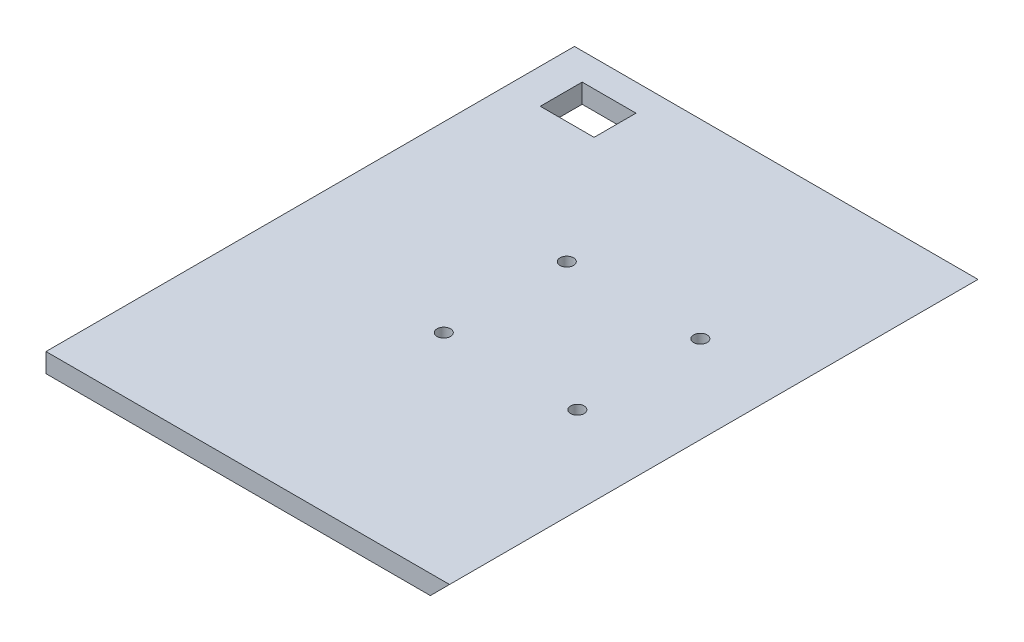
ISO-10303-21;
HEADER;
FILE_DESCRIPTION(('STEP AP214'),'2;1');
FILE_NAME('part.step','',(''),(''),'','','');
FILE_SCHEMA(('AUTOMOTIVE_DESIGN { 1 0 10303 214 1 1 1 1 }'));
ENDSEC;
DATA;
#1=APPLICATION_CONTEXT('core data for automotive mechanical design processes');
#2=APPLICATION_PROTOCOL_DEFINITION('international standard','automotive_design',2000,#1);
#3=PRODUCT_CONTEXT('',#1,'mechanical');
#4=PRODUCT('Part','Part','',(#3));
#5=PRODUCT_RELATED_PRODUCT_CATEGORY('part','',(#4));
#6=PRODUCT_DEFINITION_FORMATION('','',#4);
#7=PRODUCT_DEFINITION_CONTEXT('part definition',#1,'design');
#8=PRODUCT_DEFINITION('design','',#6,#7);
#9=PRODUCT_DEFINITION_SHAPE('','',#8);
#10=(LENGTH_UNIT() NAMED_UNIT(*) SI_UNIT(.MILLI.,.METRE.));
#11=(NAMED_UNIT(*) PLANE_ANGLE_UNIT() SI_UNIT($,.RADIAN.));
#12=(NAMED_UNIT(*) SI_UNIT($,.STERADIAN.) SOLID_ANGLE_UNIT());
#13=UNCERTAINTY_MEASURE_WITH_UNIT(LENGTH_MEASURE(1.E-05),#10,'distance_accuracy_value','');
#14=(GEOMETRIC_REPRESENTATION_CONTEXT(3) GLOBAL_UNCERTAINTY_ASSIGNED_CONTEXT((#13)) GLOBAL_UNIT_ASSIGNED_CONTEXT((#10,
#11,#12)) REPRESENTATION_CONTEXT('',''));
#15=CARTESIAN_POINT('',(0.,0.,0.));
#16=DIRECTION('',(0.,0.,1.));
#17=DIRECTION('',(1.,0.,0.));
#18=AXIS2_PLACEMENT_3D('',#15,#16,#17);
#19=CARTESIAN_POINT('',(200.,10.,0.));
#20=DIRECTION('',(0.,0.,-1.));
#21=DIRECTION('',(-1.,0.,0.));
#22=AXIS2_PLACEMENT_3D('',#19,#20,#21);
#23=PLANE('',#22);
#24=DIRECTION('',(-1.,0.,0.));
#25=VECTOR('',#24,1.);
#26=CARTESIAN_POINT('',(200.,0.,0.));
#27=LINE('',#26,#25);
#28=CARTESIAN_POINT('',(200.,0.,0.));
#29=VERTEX_POINT('',#28);
#30=CARTESIAN_POINT('',(0.,0.,0.));
#31=VERTEX_POINT('',#30);
#32=EDGE_CURVE('E11',#29,#31,#27,.T.);
#33=ORIENTED_EDGE('',*,*,#32,.F.);
#34=DIRECTION('',(0.707106781186557,0.707106781186538,0.));
#35=VECTOR('',#34,1.);
#36=CARTESIAN_POINT('',(210.,10.,0.));
#37=LINE('',#36,#35);
#38=CARTESIAN_POINT('',(210.,10.,0.));
#39=VERTEX_POINT('',#38);
#40=EDGE_CURVE('E165',#29,#39,#37,.T.);
#41=ORIENTED_EDGE('',*,*,#40,.T.);
#42=DIRECTION('',(-1.,0.,0.));
#43=VECTOR('',#42,1.);
#44=CARTESIAN_POINT('',(200.,10.,0.));
#45=LINE('',#44,#43);
#46=CARTESIAN_POINT('',(0.,10.,0.));
#47=VERTEX_POINT('',#46);
#48=EDGE_CURVE('E183',#39,#47,#45,.T.);
#49=ORIENTED_EDGE('',*,*,#48,.T.);
#50=DIRECTION('',(0.,-1.,0.));
#51=VECTOR('',#50,1.);
#52=CARTESIAN_POINT('',(0.,10.,0.));
#53=LINE('',#52,#51);
#54=EDGE_CURVE('E173',#47,#31,#53,.T.);
#55=ORIENTED_EDGE('',*,*,#54,.T.);
#56=EDGE_LOOP('',(#33,#41,#49,#55));
#57=FACE_BOUND('',#56,.T.);
#58=ADVANCED_FACE('F41',(#57),#23,.F.);
#59=CARTESIAN_POINT('',(200.,0.,0.));
#60=DIRECTION('',(0.,1.,0.));
#61=DIRECTION('',(0.,0.,1.));
#62=AXIS2_PLACEMENT_3D('',#59,#60,#61);
#63=PLANE('',#62);
#64=DIRECTION('',(-1.,0.,0.));
#65=VECTOR('',#64,1.);
#66=CARTESIAN_POINT('',(18.0906878364255,0.,-260.929608881838));
#67=LINE('',#66,#65);
#68=CARTESIAN_POINT('',(46.0906878364255,0.,-260.929608881838));
#69=VERTEX_POINT('',#68);
#70=CARTESIAN_POINT('',(18.0906878364255,0.,-260.929608881838));
#71=VERTEX_POINT('',#70);
#72=EDGE_CURVE('E112',#69,#71,#67,.T.);
#73=ORIENTED_EDGE('',*,*,#72,.T.);
#74=DIRECTION('',(0.,0.,1.));
#75=VECTOR('',#74,1.);
#76=CARTESIAN_POINT('',(18.0906878364255,0.,-260.929608881838));
#77=LINE('',#76,#75);
#78=CARTESIAN_POINT('',(18.0906878364255,0.,-239.129608881838));
#79=VERTEX_POINT('',#78);
#80=EDGE_CURVE('E106',#71,#79,#77,.T.);
#81=ORIENTED_EDGE('',*,*,#80,.T.);
#82=DIRECTION('',(1.,0.,0.));
#83=VECTOR('',#82,1.);
#84=CARTESIAN_POINT('',(18.0906878364255,0.,-239.129608881838));
#85=LINE('',#84,#83);
#86=CARTESIAN_POINT('',(46.0906878364255,0.,-239.129608881838));
#87=VERTEX_POINT('',#86);
#88=EDGE_CURVE('E115',#79,#87,#85,.T.);
#89=ORIENTED_EDGE('',*,*,#88,.T.);
#90=DIRECTION('',(0.,0.,-1.));
#91=VECTOR('',#90,1.);
#92=CARTESIAN_POINT('',(46.0906878364255,0.,-260.929608881838));
#93=LINE('',#92,#91);
#94=EDGE_CURVE('E55',#87,#69,#93,.T.);
#95=ORIENTED_EDGE('',*,*,#94,.T.);
#96=EDGE_LOOP('',(#73,#81,#89,#95));
#97=FACE_BOUND('',#96,.T.);
#98=CARTESIAN_POINT('',(164.499999999957,0.,-176.01));
#99=DIRECTION('',(0.,1.,0.));
#100=DIRECTION('',(0.,0.,1.));
#101=AXIS2_PLACEMENT_3D('',#98,#99,#100);
#102=CIRCLE('',#101,3.50000000000006);
#103=CARTESIAN_POINT('',(164.499999999957,0.,-172.51));
#104=VERTEX_POINT('',#103);
#105=EDGE_CURVE('E147',#104,#104,#102,.F.);
#106=ORIENTED_EDGE('',*,*,#105,.F.);
#107=EDGE_LOOP('',(#106));
#108=FACE_BOUND('',#107,.T.);
#109=CARTESIAN_POINT('',(94.9999999999638,0.,-112.009999999992));
#110=DIRECTION('',(0.,1.,0.));
#111=DIRECTION('',(0.,0.,1.));
#112=AXIS2_PLACEMENT_3D('',#109,#110,#111);
#113=CIRCLE('',#112,3.50000000000002);
#114=CARTESIAN_POINT('',(94.9999999999638,0.,-108.509999999992));
#115=VERTEX_POINT('',#114);
#116=EDGE_CURVE('E146',#115,#115,#113,.F.);
#117=ORIENTED_EDGE('',*,*,#116,.F.);
#118=EDGE_LOOP('',(#117));
#119=FACE_BOUND('',#118,.T.);
#120=CARTESIAN_POINT('',(164.499999999964,0.,-112.01));
#121=DIRECTION('',(0.,1.,0.));
#122=DIRECTION('',(0.,0.,1.));
#123=AXIS2_PLACEMENT_3D('',#120,#121,#122);
#124=CIRCLE('',#123,3.50000000000002);
#125=CARTESIAN_POINT('',(164.499999999964,0.,-108.51));
#126=VERTEX_POINT('',#125);
#127=EDGE_CURVE('E137',#126,#126,#124,.F.);
#128=ORIENTED_EDGE('',*,*,#127,.F.);
#129=EDGE_LOOP('',(#128));
#130=FACE_BOUND('',#129,.T.);
#131=CARTESIAN_POINT('',(94.999999999957,0.,-176.009999999992));
#132=DIRECTION('',(0.,1.,0.));
#133=DIRECTION('',(0.,0.,1.));
#134=AXIS2_PLACEMENT_3D('',#131,#132,#133);
#135=CIRCLE('',#134,3.50000000000005);
#136=CARTESIAN_POINT('',(94.999999999957,0.,-172.509999999992));
#137=VERTEX_POINT('',#136);
#138=EDGE_CURVE('E161',#137,#137,#135,.F.);
#139=ORIENTED_EDGE('',*,*,#138,.F.);
#140=EDGE_LOOP('',(#139));
#141=FACE_BOUND('',#140,.T.);
#142=DIRECTION('',(-1.,0.,0.));
#143=VECTOR('',#142,1.);
#144=CARTESIAN_POINT('',(200.,0.,-275.));
#145=LINE('',#144,#143);
#146=CARTESIAN_POINT('',(200.,0.,-275.));
#147=VERTEX_POINT('',#146);
#148=CARTESIAN_POINT('',(0.,0.,-275.));
#149=VERTEX_POINT('',#148);
#150=EDGE_CURVE('E48',#147,#149,#145,.T.);
#151=ORIENTED_EDGE('',*,*,#150,.F.);
#152=DIRECTION('',(0.,0.,-1.));
#153=VECTOR('',#152,1.);
#154=CARTESIAN_POINT('',(200.,0.,0.));
#155=LINE('',#154,#153);
#156=EDGE_CURVE('E168',#29,#147,#155,.T.);
#157=ORIENTED_EDGE('',*,*,#156,.F.);
#158=ORIENTED_EDGE('',*,*,#32,.T.);
#159=DIRECTION('',(0.,0.,-1.));
#160=VECTOR('',#159,1.);
#161=CARTESIAN_POINT('',(0.,0.,0.));
#162=LINE('',#161,#160);
#163=EDGE_CURVE('E176',#31,#149,#162,.T.);
#164=ORIENTED_EDGE('',*,*,#163,.T.);
#165=EDGE_LOOP('',(#151,#157,#158,#164));
#166=FACE_BOUND('',#165,.T.);
#167=ADVANCED_FACE('F119',(#97,#108,#119,#130,#141,#166),#63,.F.);
#168=CARTESIAN_POINT('',(200.,10.,-275.));
#169=DIRECTION('',(0.,0.,1.));
#170=DIRECTION('',(1.,0.,0.));
#171=AXIS2_PLACEMENT_3D('',#168,#169,#170);
#172=PLANE('',#171);
#173=DIRECTION('',(-1.,0.,0.));
#174=VECTOR('',#173,1.);
#175=CARTESIAN_POINT('',(200.,10.,-275.));
#176=LINE('',#175,#174);
#177=CARTESIAN_POINT('',(210.,10.,-275.));
#178=VERTEX_POINT('',#177);
#179=CARTESIAN_POINT('',(0.,10.,-275.));
#180=VERTEX_POINT('',#179);
#181=EDGE_CURVE('E186',#178,#180,#176,.T.);
#182=ORIENTED_EDGE('',*,*,#181,.F.);
#183=DIRECTION('',(0.707106781186557,0.707106781186538,0.));
#184=VECTOR('',#183,1.);
#185=CARTESIAN_POINT('',(210.,10.,-275.));
#186=LINE('',#185,#184);
#187=EDGE_CURVE('E164',#147,#178,#186,.T.);
#188=ORIENTED_EDGE('',*,*,#187,.F.);
#189=ORIENTED_EDGE('',*,*,#150,.T.);
#190=DIRECTION('',(0.,1.,0.));
#191=VECTOR('',#190,1.);
#192=CARTESIAN_POINT('',(0.,10.,-275.));
#193=LINE('',#192,#191);
#194=EDGE_CURVE('E179',#149,#180,#193,.T.);
#195=ORIENTED_EDGE('',*,*,#194,.T.);
#196=EDGE_LOOP('',(#182,#188,#189,#195));
#197=FACE_BOUND('',#196,.T.);
#198=ADVANCED_FACE('F192',(#197),#172,.F.);
#199=CARTESIAN_POINT('',(200.,10.,0.));
#200=DIRECTION('',(0.,-1.,0.));
#201=DIRECTION('',(0.,0.,-1.));
#202=AXIS2_PLACEMENT_3D('',#199,#200,#201);
#203=PLANE('',#202);
#204=DIRECTION('',(1.,0.,0.));
#205=VECTOR('',#204,1.);
#206=CARTESIAN_POINT('',(18.0906878364255,10.,-239.129608881838));
#207=LINE('',#206,#205);
#208=CARTESIAN_POINT('',(18.0906878364255,10.,-239.129608881838));
#209=VERTEX_POINT('',#208);
#210=CARTESIAN_POINT('',(46.0906878364255,10.,-239.129608881838));
#211=VERTEX_POINT('',#210);
#212=EDGE_CURVE('E131',#209,#211,#207,.T.);
#213=ORIENTED_EDGE('',*,*,#212,.F.);
#214=DIRECTION('',(0.,0.,1.));
#215=VECTOR('',#214,1.);
#216=CARTESIAN_POINT('',(18.0906878364255,10.,-260.929608881838));
#217=LINE('',#216,#215);
#218=CARTESIAN_POINT('',(18.0906878364255,10.,-260.929608881838));
#219=VERTEX_POINT('',#218);
#220=EDGE_CURVE('E63',#219,#209,#217,.T.);
#221=ORIENTED_EDGE('',*,*,#220,.F.);
#222=DIRECTION('',(-1.,0.,0.));
#223=VECTOR('',#222,1.);
#224=CARTESIAN_POINT('',(18.0906878364255,10.,-260.929608881838));
#225=LINE('',#224,#223);
#226=CARTESIAN_POINT('',(46.0906878364255,10.,-260.929608881838));
#227=VERTEX_POINT('',#226);
#228=EDGE_CURVE('E122',#227,#219,#225,.T.);
#229=ORIENTED_EDGE('',*,*,#228,.F.);
#230=DIRECTION('',(0.,0.,-1.));
#231=VECTOR('',#230,1.);
#232=CARTESIAN_POINT('',(46.0906878364255,10.,-260.929608881838));
#233=LINE('',#232,#231);
#234=EDGE_CURVE('E125',#211,#227,#233,.T.);
#235=ORIENTED_EDGE('',*,*,#234,.F.);
#236=EDGE_LOOP('',(#213,#221,#229,#235));
#237=FACE_BOUND('',#236,.T.);
#238=CARTESIAN_POINT('',(164.499999999957,10.,-176.01));
#239=DIRECTION('',(0.,1.,0.));
#240=DIRECTION('',(0.,0.,1.));
#241=AXIS2_PLACEMENT_3D('',#238,#239,#240);
#242=CIRCLE('',#241,3.50000000000006);
#243=CARTESIAN_POINT('',(164.499999999957,10.,-172.51));
#244=VERTEX_POINT('',#243);
#245=EDGE_CURVE('E150',#244,#244,#242,.T.);
#246=ORIENTED_EDGE('',*,*,#245,.F.);
#247=EDGE_LOOP('',(#246));
#248=FACE_BOUND('',#247,.T.);
#249=CARTESIAN_POINT('',(94.9999999999638,10.,-112.009999999992));
#250=DIRECTION('',(0.,1.,0.));
#251=DIRECTION('',(0.,0.,1.));
#252=AXIS2_PLACEMENT_3D('',#249,#250,#251);
#253=CIRCLE('',#252,3.50000000000002);
#254=CARTESIAN_POINT('',(94.9999999999638,10.,-108.509999999992));
#255=VERTEX_POINT('',#254);
#256=EDGE_CURVE('E151',#255,#255,#253,.T.);
#257=ORIENTED_EDGE('',*,*,#256,.F.);
#258=EDGE_LOOP('',(#257));
#259=FACE_BOUND('',#258,.T.);
#260=CARTESIAN_POINT('',(164.499999999964,10.,-112.01));
#261=DIRECTION('',(0.,1.,0.));
#262=DIRECTION('',(0.,0.,1.));
#263=AXIS2_PLACEMENT_3D('',#260,#261,#262);
#264=CIRCLE('',#263,3.50000000000002);
#265=CARTESIAN_POINT('',(164.499999999964,10.,-108.51));
#266=VERTEX_POINT('',#265);
#267=EDGE_CURVE('E143',#266,#266,#264,.T.);
#268=ORIENTED_EDGE('',*,*,#267,.F.);
#269=EDGE_LOOP('',(#268));
#270=FACE_BOUND('',#269,.T.);
#271=CARTESIAN_POINT('',(94.999999999957,10.,-176.009999999992));
#272=DIRECTION('',(0.,1.,0.));
#273=DIRECTION('',(0.,0.,1.));
#274=AXIS2_PLACEMENT_3D('',#271,#272,#273);
#275=CIRCLE('',#274,3.50000000000005);
#276=CARTESIAN_POINT('',(94.999999999957,10.,-172.509999999992));
#277=VERTEX_POINT('',#276);
#278=EDGE_CURVE('E154',#277,#277,#275,.T.);
#279=ORIENTED_EDGE('',*,*,#278,.F.);
#280=EDGE_LOOP('',(#279));
#281=FACE_BOUND('',#280,.T.);
#282=DIRECTION('',(0.,0.,1.));
#283=VECTOR('',#282,1.);
#284=CARTESIAN_POINT('',(0.,10.,0.));
#285=LINE('',#284,#283);
#286=EDGE_CURVE('E181',#180,#47,#285,.T.);
#287=ORIENTED_EDGE('',*,*,#286,.T.);
#288=ORIENTED_EDGE('',*,*,#48,.F.);
#289=DIRECTION('',(0.,0.,1.));
#290=VECTOR('',#289,1.);
#291=CARTESIAN_POINT('',(210.,10.,-275.));
#292=LINE('',#291,#290);
#293=EDGE_CURVE('E171',#178,#39,#292,.T.);
#294=ORIENTED_EDGE('',*,*,#293,.F.);
#295=ORIENTED_EDGE('',*,*,#181,.T.);
#296=EDGE_LOOP('',(#287,#288,#294,#295));
#297=FACE_BOUND('',#296,.T.);
#298=ADVANCED_FACE('F204',(#237,#248,#259,#270,#281,#297),#203,.F.);
#299=CARTESIAN_POINT('',(0.,0.,0.));
#300=DIRECTION('',(1.,0.,0.));
#301=DIRECTION('',(0.,0.,-1.));
#302=AXIS2_PLACEMENT_3D('',#299,#300,#301);
#303=PLANE('',#302);
#304=ORIENTED_EDGE('',*,*,#54,.F.);
#305=ORIENTED_EDGE('',*,*,#286,.F.);
#306=ORIENTED_EDGE('',*,*,#194,.F.);
#307=ORIENTED_EDGE('',*,*,#163,.F.);
#308=EDGE_LOOP('',(#304,#305,#306,#307));
#309=FACE_BOUND('',#308,.T.);
#310=ADVANCED_FACE('F201',(#309),#303,.F.);
#311=CARTESIAN_POINT('',(210.,10.,0.));
#312=DIRECTION('',(-0.707106781186538,0.707106781186557,0.));
#313=DIRECTION('',(-0.707106781186557,-0.707106781186538,0.));
#314=AXIS2_PLACEMENT_3D('',#311,#312,#313);
#315=PLANE('',#314);
#316=ORIENTED_EDGE('',*,*,#187,.T.);
#317=ORIENTED_EDGE('',*,*,#293,.T.);
#318=ORIENTED_EDGE('',*,*,#40,.F.);
#319=ORIENTED_EDGE('',*,*,#156,.T.);
#320=EDGE_LOOP('',(#316,#317,#318,#319));
#321=FACE_BOUND('',#320,.T.);
#322=ADVANCED_FACE('F208',(#321),#315,.F.);
#323=CARTESIAN_POINT('',(94.999999999957,-0.000999999999999265,-176.009999999992));
#324=DIRECTION('',(0.,1.,0.));
#325=DIRECTION('',(0.,0.,1.));
#326=AXIS2_PLACEMENT_3D('',#323,#324,#325);
#327=CYLINDRICAL_SURFACE('',#326,3.50000000000005);
#328=ORIENTED_EDGE('',*,*,#278,.T.);
#329=EDGE_LOOP('',(#328));
#330=FACE_BOUND('',#329,.T.);
#331=ORIENTED_EDGE('',*,*,#138,.T.);
#332=EDGE_LOOP('',(#331));
#333=FACE_BOUND('',#332,.T.);
#334=ADVANCED_FACE('F210',(#330,#333),#327,.F.);
#335=CARTESIAN_POINT('',(164.499999999964,-0.000999999999999265,-112.01));
#336=DIRECTION('',(0.,1.,0.));
#337=DIRECTION('',(0.,0.,1.));
#338=AXIS2_PLACEMENT_3D('',#335,#336,#337);
#339=CYLINDRICAL_SURFACE('',#338,3.50000000000002);
#340=ORIENTED_EDGE('',*,*,#267,.T.);
#341=EDGE_LOOP('',(#340));
#342=FACE_BOUND('',#341,.T.);
#343=ORIENTED_EDGE('',*,*,#127,.T.);
#344=EDGE_LOOP('',(#343));
#345=FACE_BOUND('',#344,.T.);
#346=ADVANCED_FACE('F216',(#342,#345),#339,.F.);
#347=CARTESIAN_POINT('',(94.9999999999638,-0.000999999999999265,-112.009999999992));
#348=DIRECTION('',(0.,1.,0.));
#349=DIRECTION('',(0.,0.,1.));
#350=AXIS2_PLACEMENT_3D('',#347,#348,#349);
#351=CYLINDRICAL_SURFACE('',#350,3.50000000000002);
#352=ORIENTED_EDGE('',*,*,#256,.T.);
#353=EDGE_LOOP('',(#352));
#354=FACE_BOUND('',#353,.T.);
#355=ORIENTED_EDGE('',*,*,#116,.T.);
#356=EDGE_LOOP('',(#355));
#357=FACE_BOUND('',#356,.T.);
#358=ADVANCED_FACE('F250',(#354,#357),#351,.F.);
#359=CARTESIAN_POINT('',(164.499999999957,-0.000999999999999265,-176.01));
#360=DIRECTION('',(0.,1.,0.));
#361=DIRECTION('',(0.,0.,1.));
#362=AXIS2_PLACEMENT_3D('',#359,#360,#361);
#363=CYLINDRICAL_SURFACE('',#362,3.50000000000006);
#364=ORIENTED_EDGE('',*,*,#245,.T.);
#365=EDGE_LOOP('',(#364));
#366=FACE_BOUND('',#365,.T.);
#367=ORIENTED_EDGE('',*,*,#105,.T.);
#368=EDGE_LOOP('',(#367));
#369=FACE_BOUND('',#368,.T.);
#370=ADVANCED_FACE('F257',(#366,#369),#363,.F.);
#371=CARTESIAN_POINT('',(18.0906878364255,0.,-260.929608881838));
#372=DIRECTION('',(-1.,0.,0.));
#373=DIRECTION('',(0.,0.,1.));
#374=AXIS2_PLACEMENT_3D('',#371,#372,#373);
#375=PLANE('',#374);
#376=ORIENTED_EDGE('',*,*,#220,.T.);
#377=DIRECTION('',(0.,1.,0.));
#378=VECTOR('',#377,1.);
#379=CARTESIAN_POINT('',(18.0906878364255,0.,-239.129608881838));
#380=LINE('',#379,#378);
#381=EDGE_CURVE('E102',#79,#209,#380,.T.);
#382=ORIENTED_EDGE('',*,*,#381,.F.);
#383=ORIENTED_EDGE('',*,*,#80,.F.);
#384=DIRECTION('',(0.,1.,0.));
#385=VECTOR('',#384,1.);
#386=CARTESIAN_POINT('',(18.0906878364255,0.,-260.929608881838));
#387=LINE('',#386,#385);
#388=EDGE_CURVE('E135',#71,#219,#387,.T.);
#389=ORIENTED_EDGE('',*,*,#388,.T.);
#390=EDGE_LOOP('',(#376,#382,#383,#389));
#391=FACE_BOUND('',#390,.T.);
#392=ADVANCED_FACE('F104',(#391),#375,.F.);
#393=CARTESIAN_POINT('',(18.0906878364255,0.,-260.929608881838));
#394=DIRECTION('',(0.,0.,-1.));
#395=DIRECTION('',(-1.,0.,0.));
#396=AXIS2_PLACEMENT_3D('',#393,#394,#395);
#397=PLANE('',#396);
#398=ORIENTED_EDGE('',*,*,#228,.T.);
#399=ORIENTED_EDGE('',*,*,#388,.F.);
#400=ORIENTED_EDGE('',*,*,#72,.F.);
#401=DIRECTION('',(0.,1.,0.));
#402=VECTOR('',#401,1.);
#403=CARTESIAN_POINT('',(46.0906878364255,0.,-260.929608881838));
#404=LINE('',#403,#402);
#405=EDGE_CURVE('E138',#69,#227,#404,.T.);
#406=ORIENTED_EDGE('',*,*,#405,.T.);
#407=EDGE_LOOP('',(#398,#399,#400,#406));
#408=FACE_BOUND('',#407,.T.);
#409=ADVANCED_FACE('F266',(#408),#397,.F.);
#410=CARTESIAN_POINT('',(46.0906878364255,0.,-260.929608881838));
#411=DIRECTION('',(1.,0.,0.));
#412=DIRECTION('',(0.,0.,-1.));
#413=AXIS2_PLACEMENT_3D('',#410,#411,#412);
#414=PLANE('',#413);
#415=ORIENTED_EDGE('',*,*,#234,.T.);
#416=ORIENTED_EDGE('',*,*,#405,.F.);
#417=ORIENTED_EDGE('',*,*,#94,.F.);
#418=DIRECTION('',(0.,1.,0.));
#419=VECTOR('',#418,1.);
#420=CARTESIAN_POINT('',(46.0906878364255,0.,-239.129608881838));
#421=LINE('',#420,#419);
#422=EDGE_CURVE('E111',#87,#211,#421,.T.);
#423=ORIENTED_EDGE('',*,*,#422,.T.);
#424=EDGE_LOOP('',(#415,#416,#417,#423));
#425=FACE_BOUND('',#424,.T.);
#426=ADVANCED_FACE('F275',(#425),#414,.F.);
#427=CARTESIAN_POINT('',(18.0906878364255,0.,-239.129608881838));
#428=DIRECTION('',(0.,0.,1.));
#429=DIRECTION('',(1.,0.,0.));
#430=AXIS2_PLACEMENT_3D('',#427,#428,#429);
#431=PLANE('',#430);
#432=ORIENTED_EDGE('',*,*,#212,.T.);
#433=ORIENTED_EDGE('',*,*,#422,.F.);
#434=ORIENTED_EDGE('',*,*,#88,.F.);
#435=ORIENTED_EDGE('',*,*,#381,.T.);
#436=EDGE_LOOP('',(#432,#433,#434,#435));
#437=FACE_BOUND('',#436,.T.);
#438=ADVANCED_FACE('F116',(#437),#431,.F.);
#439=CLOSED_SHELL('',(#58,#167,#198,#298,#310,#322,#334,#346,#358,#370,#392,#409,#426,#438));
#440=MANIFOLD_SOLID_BREP('B2',#439);
#441=ADVANCED_BREP_SHAPE_REPRESENTATION('',(#18,#440),#14);
#442=SHAPE_DEFINITION_REPRESENTATION(#9,#441);
ENDSEC;
END-ISO-10303-21;
